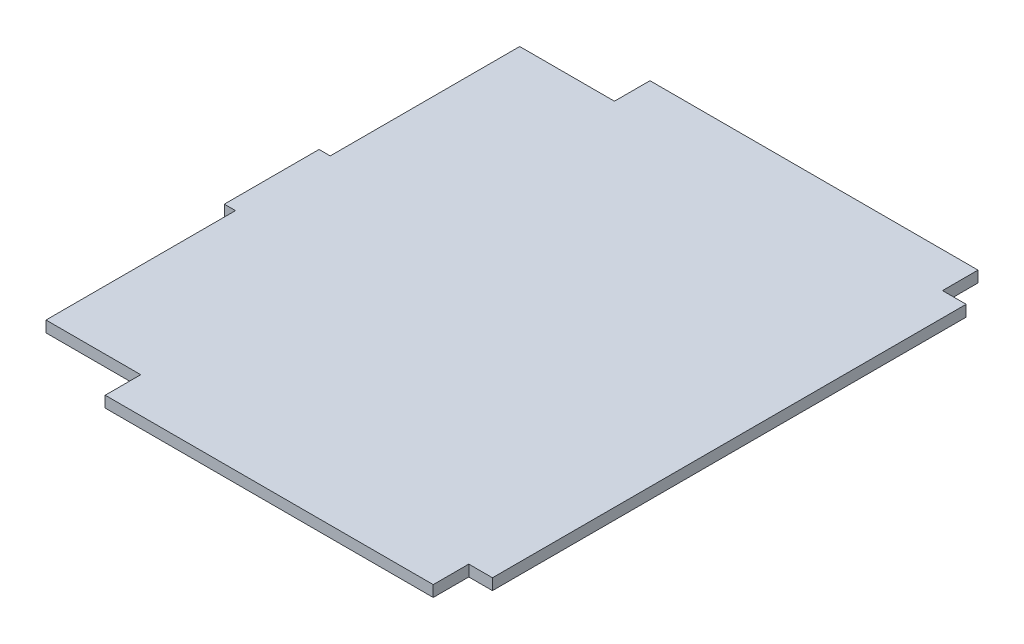
ISO-10303-21;
HEADER;
FILE_DESCRIPTION(('STEP AP214'),'2;1');
FILE_NAME('part.step','',(''),(''),'','','');
FILE_SCHEMA(('AUTOMOTIVE_DESIGN { 1 0 10303 214 1 1 1 1 }'));
ENDSEC;
DATA;
#1=APPLICATION_CONTEXT('core data for automotive mechanical design processes');
#2=APPLICATION_PROTOCOL_DEFINITION('international standard','automotive_design',2000,#1);
#3=PRODUCT_CONTEXT('',#1,'mechanical');
#4=PRODUCT('Part','Part','',(#3));
#5=PRODUCT_RELATED_PRODUCT_CATEGORY('part','',(#4));
#6=PRODUCT_DEFINITION_FORMATION('','',#4);
#7=PRODUCT_DEFINITION_CONTEXT('part definition',#1,'design');
#8=PRODUCT_DEFINITION('design','',#6,#7);
#9=PRODUCT_DEFINITION_SHAPE('','',#8);
#10=(LENGTH_UNIT() NAMED_UNIT(*) SI_UNIT(.MILLI.,.METRE.));
#11=(NAMED_UNIT(*) PLANE_ANGLE_UNIT() SI_UNIT($,.RADIAN.));
#12=(NAMED_UNIT(*) SI_UNIT($,.STERADIAN.) SOLID_ANGLE_UNIT());
#13=UNCERTAINTY_MEASURE_WITH_UNIT(LENGTH_MEASURE(1.E-05),#10,'distance_accuracy_value','');
#14=(GEOMETRIC_REPRESENTATION_CONTEXT(3) GLOBAL_UNCERTAINTY_ASSIGNED_CONTEXT((#13)) GLOBAL_UNIT_ASSIGNED_CONTEXT((#10,
#11,#12)) REPRESENTATION_CONTEXT('',''));
#15=CARTESIAN_POINT('',(0.,0.,0.));
#16=DIRECTION('',(0.,0.,1.));
#17=DIRECTION('',(1.,0.,0.));
#18=AXIS2_PLACEMENT_3D('',#15,#16,#17);
#19=CARTESIAN_POINT('',(0.,2.9972,73.025));
#20=DIRECTION('',(0.,0.,1.));
#21=DIRECTION('',(1.,0.,0.));
#22=AXIS2_PLACEMENT_3D('',#19,#20,#21);
#23=PLANE('',#22);
#24=DIRECTION('',(-1.,0.,0.));
#25=VECTOR('',#24,1.);
#26=CARTESIAN_POINT('',(0.,0.,73.025));
#27=LINE('',#26,#25);
#28=CARTESIAN_POINT('',(53.497343983,0.,73.025));
#29=VERTEX_POINT('',#28);
#30=CARTESIAN_POINT('',(-34.447343983,0.,73.025));
#31=VERTEX_POINT('',#30);
#32=EDGE_CURVE('E288',#29,#31,#27,.T.);
#33=ORIENTED_EDGE('',*,*,#32,.F.);
#34=DIRECTION('',(0.,-1.,0.));
#35=VECTOR('',#34,1.);
#36=CARTESIAN_POINT('',(53.497343983,2.9972,73.025));
#37=LINE('',#36,#35);
#38=CARTESIAN_POINT('',(53.497343983,2.9972,73.025));
#39=VERTEX_POINT('',#38);
#40=EDGE_CURVE('E11',#39,#29,#37,.T.);
#41=ORIENTED_EDGE('',*,*,#40,.F.);
#42=DIRECTION('',(-1.,0.,0.));
#43=VECTOR('',#42,1.);
#44=CARTESIAN_POINT('',(0.,2.9972,73.025));
#45=LINE('',#44,#43);
#46=CARTESIAN_POINT('',(-34.447343983,2.9972,73.025));
#47=VERTEX_POINT('',#46);
#48=EDGE_CURVE('E225',#39,#47,#45,.T.);
#49=ORIENTED_EDGE('',*,*,#48,.T.);
#50=DIRECTION('',(0.,-1.,0.));
#51=VECTOR('',#50,1.);
#52=CARTESIAN_POINT('',(-34.447343983,2.9972,73.025));
#53=LINE('',#52,#51);
#54=EDGE_CURVE('E58',#47,#31,#53,.T.);
#55=ORIENTED_EDGE('',*,*,#54,.T.);
#56=EDGE_LOOP('',(#33,#41,#49,#55));
#57=FACE_BOUND('',#56,.T.);
#58=ADVANCED_FACE('F41',(#57),#23,.T.);
#59=CARTESIAN_POINT('',(53.497343983,2.9972,0.));
#60=DIRECTION('',(-1.,0.,0.));
#61=DIRECTION('',(0.,0.,1.));
#62=AXIS2_PLACEMENT_3D('',#59,#60,#61);
#63=PLANE('',#62);
#64=DIRECTION('',(0.,0.,-1.));
#65=VECTOR('',#64,1.);
#66=CARTESIAN_POINT('',(53.497343983,0.,0.));
#67=LINE('',#66,#65);
#68=CARTESIAN_POINT('',(53.497343983,0.,63.5));
#69=VERTEX_POINT('',#68);
#70=EDGE_CURVE('E285',#29,#69,#67,.T.);
#71=ORIENTED_EDGE('',*,*,#70,.T.);
#72=DIRECTION('',(0.,-1.,0.));
#73=VECTOR('',#72,1.);
#74=CARTESIAN_POINT('',(53.497343983,2.9972,63.5));
#75=LINE('',#74,#73);
#76=CARTESIAN_POINT('',(53.497343983,2.9972,63.5));
#77=VERTEX_POINT('',#76);
#78=EDGE_CURVE('E50',#77,#69,#75,.T.);
#79=ORIENTED_EDGE('',*,*,#78,.F.);
#80=DIRECTION('',(0.,0.,-1.));
#81=VECTOR('',#80,1.);
#82=CARTESIAN_POINT('',(53.497343983,2.9972,0.));
#83=LINE('',#82,#81);
#84=EDGE_CURVE('E222',#39,#77,#83,.T.);
#85=ORIENTED_EDGE('',*,*,#84,.F.);
#86=ORIENTED_EDGE('',*,*,#40,.T.);
#87=EDGE_LOOP('',(#71,#79,#85,#86));
#88=FACE_BOUND('',#87,.T.);
#89=ADVANCED_FACE('F286',(#88),#63,.F.);
#90=CARTESIAN_POINT('',(0.,2.9972,63.5));
#91=DIRECTION('',(0.,0.,1.));
#92=DIRECTION('',(1.,0.,0.));
#93=AXIS2_PLACEMENT_3D('',#90,#91,#92);
#94=PLANE('',#93);
#95=DIRECTION('',(-1.,0.,0.));
#96=VECTOR('',#95,1.);
#97=CARTESIAN_POINT('',(0.,0.,63.5));
#98=LINE('',#97,#96);
#99=CARTESIAN_POINT('',(59.847343983,0.,63.5));
#100=VERTEX_POINT('',#99);
#101=EDGE_CURVE('E281',#100,#69,#98,.T.);
#102=ORIENTED_EDGE('',*,*,#101,.F.);
#103=DIRECTION('',(0.,-1.,0.));
#104=VECTOR('',#103,1.);
#105=CARTESIAN_POINT('',(59.847343983,2.9972,63.5));
#106=LINE('',#105,#104);
#107=CARTESIAN_POINT('',(59.847343983,2.9972,63.5));
#108=VERTEX_POINT('',#107);
#109=EDGE_CURVE('E272',#108,#100,#106,.T.);
#110=ORIENTED_EDGE('',*,*,#109,.F.);
#111=DIRECTION('',(-1.,0.,0.));
#112=VECTOR('',#111,1.);
#113=CARTESIAN_POINT('',(0.,2.9972,63.5));
#114=LINE('',#113,#112);
#115=EDGE_CURVE('E218',#108,#77,#114,.T.);
#116=ORIENTED_EDGE('',*,*,#115,.T.);
#117=ORIENTED_EDGE('',*,*,#78,.T.);
#118=EDGE_LOOP('',(#102,#110,#116,#117));
#119=FACE_BOUND('',#118,.T.);
#120=ADVANCED_FACE('F279',(#119),#94,.T.);
#121=CARTESIAN_POINT('',(59.847343983,2.9972,0.));
#122=DIRECTION('',(-1.,0.,0.));
#123=DIRECTION('',(0.,0.,1.));
#124=AXIS2_PLACEMENT_3D('',#121,#122,#123);
#125=PLANE('',#124);
#126=DIRECTION('',(0.,0.,-1.));
#127=VECTOR('',#126,1.);
#128=CARTESIAN_POINT('',(59.847343983,0.,0.));
#129=LINE('',#128,#127);
#130=CARTESIAN_POINT('',(59.847343983,0.,-63.5));
#131=VERTEX_POINT('',#130);
#132=EDGE_CURVE('E293',#100,#131,#129,.T.);
#133=ORIENTED_EDGE('',*,*,#132,.T.);
#134=DIRECTION('',(0.,-1.,0.));
#135=VECTOR('',#134,1.);
#136=CARTESIAN_POINT('',(59.847343983,2.9972,-63.5));
#137=LINE('',#136,#135);
#138=CARTESIAN_POINT('',(59.847343983,2.9972,-63.5));
#139=VERTEX_POINT('',#138);
#140=EDGE_CURVE('E268',#139,#131,#137,.T.);
#141=ORIENTED_EDGE('',*,*,#140,.F.);
#142=DIRECTION('',(0.,0.,-1.));
#143=VECTOR('',#142,1.);
#144=CARTESIAN_POINT('',(59.847343983,2.9972,0.));
#145=LINE('',#144,#143);
#146=EDGE_CURVE('E215',#108,#139,#145,.T.);
#147=ORIENTED_EDGE('',*,*,#146,.F.);
#148=ORIENTED_EDGE('',*,*,#109,.T.);
#149=EDGE_LOOP('',(#133,#141,#147,#148));
#150=FACE_BOUND('',#149,.T.);
#151=ADVANCED_FACE('F371',(#150),#125,.F.);
#152=CARTESIAN_POINT('',(0.,2.9972,-63.5));
#153=DIRECTION('',(0.,0.,1.));
#154=DIRECTION('',(1.,0.,0.));
#155=AXIS2_PLACEMENT_3D('',#152,#153,#154);
#156=PLANE('',#155);
#157=DIRECTION('',(-1.,0.,0.));
#158=VECTOR('',#157,1.);
#159=CARTESIAN_POINT('',(0.,0.,-63.5));
#160=LINE('',#159,#158);
#161=CARTESIAN_POINT('',(53.497343983,0.,-63.5));
#162=VERTEX_POINT('',#161);
#163=EDGE_CURVE('E297',#131,#162,#160,.T.);
#164=ORIENTED_EDGE('',*,*,#163,.T.);
#165=DIRECTION('',(0.,-1.,0.));
#166=VECTOR('',#165,1.);
#167=CARTESIAN_POINT('',(53.497343983,2.9972,-63.5));
#168=LINE('',#167,#166);
#169=CARTESIAN_POINT('',(53.497343983,2.9972,-63.5));
#170=VERTEX_POINT('',#169);
#171=EDGE_CURVE('E265',#170,#162,#168,.T.);
#172=ORIENTED_EDGE('',*,*,#171,.F.);
#173=DIRECTION('',(-1.,0.,0.));
#174=VECTOR('',#173,1.);
#175=CARTESIAN_POINT('',(0.,2.9972,-63.5));
#176=LINE('',#175,#174);
#177=EDGE_CURVE('E212',#139,#170,#176,.T.);
#178=ORIENTED_EDGE('',*,*,#177,.F.);
#179=ORIENTED_EDGE('',*,*,#140,.T.);
#180=EDGE_LOOP('',(#164,#172,#178,#179));
#181=FACE_BOUND('',#180,.T.);
#182=ADVANCED_FACE('F366',(#181),#156,.F.);
#183=CARTESIAN_POINT('',(53.497343983,2.9972,0.));
#184=DIRECTION('',(1.,0.,0.));
#185=DIRECTION('',(0.,0.,-1.));
#186=AXIS2_PLACEMENT_3D('',#183,#184,#185);
#187=PLANE('',#186);
#188=DIRECTION('',(0.,0.,1.));
#189=VECTOR('',#188,1.);
#190=CARTESIAN_POINT('',(53.497343983,0.,0.));
#191=LINE('',#190,#189);
#192=CARTESIAN_POINT('',(53.497343983,0.,-73.025));
#193=VERTEX_POINT('',#192);
#194=EDGE_CURVE('E304',#193,#162,#191,.T.);
#195=ORIENTED_EDGE('',*,*,#194,.F.);
#196=DIRECTION('',(0.,-1.,0.));
#197=VECTOR('',#196,1.);
#198=CARTESIAN_POINT('',(53.497343983,2.9972,-73.025));
#199=LINE('',#198,#197);
#200=CARTESIAN_POINT('',(53.497343983,2.9972,-73.025));
#201=VERTEX_POINT('',#200);
#202=EDGE_CURVE('E262',#201,#193,#199,.T.);
#203=ORIENTED_EDGE('',*,*,#202,.F.);
#204=DIRECTION('',(0.,0.,1.));
#205=VECTOR('',#204,1.);
#206=CARTESIAN_POINT('',(53.497343983,2.9972,0.));
#207=LINE('',#206,#205);
#208=EDGE_CURVE('E208',#201,#170,#207,.T.);
#209=ORIENTED_EDGE('',*,*,#208,.T.);
#210=ORIENTED_EDGE('',*,*,#171,.T.);
#211=EDGE_LOOP('',(#195,#203,#209,#210));
#212=FACE_BOUND('',#211,.T.);
#213=ADVANCED_FACE('F363',(#212),#187,.T.);
#214=CARTESIAN_POINT('',(0.,2.9972,-73.025));
#215=DIRECTION('',(0.,0.,1.));
#216=DIRECTION('',(1.,0.,0.));
#217=AXIS2_PLACEMENT_3D('',#214,#215,#216);
#218=PLANE('',#217);
#219=DIRECTION('',(-1.,0.,0.));
#220=VECTOR('',#219,1.);
#221=CARTESIAN_POINT('',(0.,0.,-73.025));
#222=LINE('',#221,#220);
#223=CARTESIAN_POINT('',(-34.447343983,0.,-73.025));
#224=VERTEX_POINT('',#223);
#225=EDGE_CURVE('E308',#193,#224,#222,.T.);
#226=ORIENTED_EDGE('',*,*,#225,.T.);
#227=DIRECTION('',(0.,-1.,0.));
#228=VECTOR('',#227,1.);
#229=CARTESIAN_POINT('',(-34.447343983,2.9972,-73.025));
#230=LINE('',#229,#228);
#231=CARTESIAN_POINT('',(-34.447343983,2.9972,-73.025));
#232=VERTEX_POINT('',#231);
#233=EDGE_CURVE('E258',#232,#224,#230,.T.);
#234=ORIENTED_EDGE('',*,*,#233,.F.);
#235=DIRECTION('',(-1.,0.,0.));
#236=VECTOR('',#235,1.);
#237=CARTESIAN_POINT('',(0.,2.9972,-73.025));
#238=LINE('',#237,#236);
#239=EDGE_CURVE('E203',#201,#232,#238,.T.);
#240=ORIENTED_EDGE('',*,*,#239,.F.);
#241=ORIENTED_EDGE('',*,*,#202,.T.);
#242=EDGE_LOOP('',(#226,#234,#240,#241));
#243=FACE_BOUND('',#242,.T.);
#244=ADVANCED_FACE('F360',(#243),#218,.F.);
#245=CARTESIAN_POINT('',(-34.447343983,2.9972,0.));
#246=DIRECTION('',(1.,0.,0.));
#247=DIRECTION('',(0.,0.,-1.));
#248=AXIS2_PLACEMENT_3D('',#245,#246,#247);
#249=PLANE('',#248);
#250=DIRECTION('',(0.,0.,1.));
#251=VECTOR('',#250,1.);
#252=CARTESIAN_POINT('',(-34.447343983,0.,0.));
#253=LINE('',#252,#251);
#254=CARTESIAN_POINT('',(-34.447343983,0.,-63.5));
#255=VERTEX_POINT('',#254);
#256=EDGE_CURVE('E311',#224,#255,#253,.T.);
#257=ORIENTED_EDGE('',*,*,#256,.T.);
#258=DIRECTION('',(0.,-1.,0.));
#259=VECTOR('',#258,1.);
#260=CARTESIAN_POINT('',(-34.447343983,2.9972,-63.5));
#261=LINE('',#260,#259);
#262=CARTESIAN_POINT('',(-34.447343983,2.9972,-63.5));
#263=VERTEX_POINT('',#262);
#264=EDGE_CURVE('E255',#263,#255,#261,.T.);
#265=ORIENTED_EDGE('',*,*,#264,.F.);
#266=DIRECTION('',(0.,0.,1.));
#267=VECTOR('',#266,1.);
#268=CARTESIAN_POINT('',(-34.447343983,2.9972,0.));
#269=LINE('',#268,#267);
#270=EDGE_CURVE('E199',#232,#263,#269,.T.);
#271=ORIENTED_EDGE('',*,*,#270,.F.);
#272=ORIENTED_EDGE('',*,*,#233,.T.);
#273=EDGE_LOOP('',(#257,#265,#271,#272));
#274=FACE_BOUND('',#273,.T.);
#275=ADVANCED_FACE('F355',(#274),#249,.F.);
#276=CARTESIAN_POINT('',(0.,2.9972,-63.5));
#277=DIRECTION('',(0.,0.,-1.));
#278=DIRECTION('',(-1.,0.,0.));
#279=AXIS2_PLACEMENT_3D('',#276,#277,#278);
#280=PLANE('',#279);
#281=DIRECTION('',(1.,0.,0.));
#282=VECTOR('',#281,1.);
#283=CARTESIAN_POINT('',(0.,0.,-63.5));
#284=LINE('',#283,#282);
#285=CARTESIAN_POINT('',(-59.847343983,0.,-63.5));
#286=VERTEX_POINT('',#285);
#287=EDGE_CURVE('E315',#286,#255,#284,.T.);
#288=ORIENTED_EDGE('',*,*,#287,.F.);
#289=DIRECTION('',(0.,-1.,0.));
#290=VECTOR('',#289,1.);
#291=CARTESIAN_POINT('',(-59.847343983,2.9972,-63.5));
#292=LINE('',#291,#290);
#293=CARTESIAN_POINT('',(-59.847343983,2.9972,-63.5));
#294=VERTEX_POINT('',#293);
#295=EDGE_CURVE('E252',#294,#286,#292,.T.);
#296=ORIENTED_EDGE('',*,*,#295,.F.);
#297=DIRECTION('',(1.,0.,0.));
#298=VECTOR('',#297,1.);
#299=CARTESIAN_POINT('',(0.,2.9972,-63.5));
#300=LINE('',#299,#298);
#301=EDGE_CURVE('E193',#294,#263,#300,.T.);
#302=ORIENTED_EDGE('',*,*,#301,.T.);
#303=ORIENTED_EDGE('',*,*,#264,.T.);
#304=EDGE_LOOP('',(#288,#296,#302,#303));
#305=FACE_BOUND('',#304,.T.);
#306=ADVANCED_FACE('F349',(#305),#280,.T.);
#307=CARTESIAN_POINT('',(-59.847343983,2.9972,0.));
#308=DIRECTION('',(-1.,0.,0.));
#309=DIRECTION('',(0.,0.,1.));
#310=AXIS2_PLACEMENT_3D('',#307,#308,#309);
#311=PLANE('',#310);
#312=DIRECTION('',(0.,0.,-1.));
#313=VECTOR('',#312,1.);
#314=CARTESIAN_POINT('',(-59.847343983,0.,0.));
#315=LINE('',#314,#313);
#316=CARTESIAN_POINT('',(-59.847343983,0.,-12.7));
#317=VERTEX_POINT('',#316);
#318=EDGE_CURVE('E319',#317,#286,#315,.T.);
#319=ORIENTED_EDGE('',*,*,#318,.F.);
#320=DIRECTION('',(0.,-1.,0.));
#321=VECTOR('',#320,1.);
#322=CARTESIAN_POINT('',(-59.847343983,2.9972,-12.7));
#323=LINE('',#322,#321);
#324=CARTESIAN_POINT('',(-59.847343983,2.9972,-12.7));
#325=VERTEX_POINT('',#324);
#326=EDGE_CURVE('E249',#325,#317,#323,.T.);
#327=ORIENTED_EDGE('',*,*,#326,.F.);
#328=DIRECTION('',(0.,0.,-1.));
#329=VECTOR('',#328,1.);
#330=CARTESIAN_POINT('',(-59.847343983,2.9972,0.));
#331=LINE('',#330,#329);
#332=EDGE_CURVE('E184',#325,#294,#331,.T.);
#333=ORIENTED_EDGE('',*,*,#332,.T.);
#334=ORIENTED_EDGE('',*,*,#295,.T.);
#335=EDGE_LOOP('',(#319,#327,#333,#334));
#336=FACE_BOUND('',#335,.T.);
#337=ADVANCED_FACE('F347',(#336),#311,.T.);
#338=CARTESIAN_POINT('',(0.,2.9972,-12.7));
#339=DIRECTION('',(0.,0.,1.));
#340=DIRECTION('',(1.,0.,0.));
#341=AXIS2_PLACEMENT_3D('',#338,#339,#340);
#342=PLANE('',#341);
#343=DIRECTION('',(-1.,0.,0.));
#344=VECTOR('',#343,1.);
#345=CARTESIAN_POINT('',(0.,0.,-12.7));
#346=LINE('',#345,#344);
#347=CARTESIAN_POINT('',(-62.844543983,0.,-12.7));
#348=VERTEX_POINT('',#347);
#349=EDGE_CURVE('E323',#317,#348,#346,.T.);
#350=ORIENTED_EDGE('',*,*,#349,.T.);
#351=DIRECTION('',(0.,-1.,0.));
#352=VECTOR('',#351,1.);
#353=CARTESIAN_POINT('',(-62.844543983,2.9972,-12.7));
#354=LINE('',#353,#352);
#355=CARTESIAN_POINT('',(-62.844543983,2.9972,-12.7));
#356=VERTEX_POINT('',#355);
#357=EDGE_CURVE('E246',#356,#348,#354,.T.);
#358=ORIENTED_EDGE('',*,*,#357,.F.);
#359=DIRECTION('',(-1.,0.,0.));
#360=VECTOR('',#359,1.);
#361=CARTESIAN_POINT('',(0.,2.9972,-12.7));
#362=LINE('',#361,#360);
#363=EDGE_CURVE('E192',#325,#356,#362,.T.);
#364=ORIENTED_EDGE('',*,*,#363,.F.);
#365=ORIENTED_EDGE('',*,*,#326,.T.);
#366=EDGE_LOOP('',(#350,#358,#364,#365));
#367=FACE_BOUND('',#366,.T.);
#368=ADVANCED_FACE('F345',(#367),#342,.F.);
#369=CARTESIAN_POINT('',(-62.844543983,2.9972,0.));
#370=DIRECTION('',(-1.,0.,0.));
#371=DIRECTION('',(0.,0.,1.));
#372=AXIS2_PLACEMENT_3D('',#369,#370,#371);
#373=PLANE('',#372);
#374=DIRECTION('',(0.,0.,-1.));
#375=VECTOR('',#374,1.);
#376=CARTESIAN_POINT('',(-62.844543983,0.,0.));
#377=LINE('',#376,#375);
#378=CARTESIAN_POINT('',(-62.844543983,0.,12.7));
#379=VERTEX_POINT('',#378);
#380=EDGE_CURVE('E327',#379,#348,#377,.T.);
#381=ORIENTED_EDGE('',*,*,#380,.F.);
#382=DIRECTION('',(0.,-1.,0.));
#383=VECTOR('',#382,1.);
#384=CARTESIAN_POINT('',(-62.844543983,2.9972,12.7));
#385=LINE('',#384,#383);
#386=CARTESIAN_POINT('',(-62.844543983,2.9972,12.7));
#387=VERTEX_POINT('',#386);
#388=EDGE_CURVE('E243',#387,#379,#385,.T.);
#389=ORIENTED_EDGE('',*,*,#388,.F.);
#390=DIRECTION('',(0.,0.,-1.));
#391=VECTOR('',#390,1.);
#392=CARTESIAN_POINT('',(-62.844543983,2.9972,0.));
#393=LINE('',#392,#391);
#394=EDGE_CURVE('E186',#387,#356,#393,.T.);
#395=ORIENTED_EDGE('',*,*,#394,.T.);
#396=ORIENTED_EDGE('',*,*,#357,.T.);
#397=EDGE_LOOP('',(#381,#389,#395,#396));
#398=FACE_BOUND('',#397,.T.);
#399=ADVANCED_FACE('F341',(#398),#373,.T.);
#400=CARTESIAN_POINT('',(0.,2.9972,12.7000000000001));
#401=DIRECTION('',(0.,0.,1.));
#402=DIRECTION('',(1.,0.,0.));
#403=AXIS2_PLACEMENT_3D('',#400,#401,#402);
#404=PLANE('',#403);
#405=DIRECTION('',(-1.,0.,0.));
#406=VECTOR('',#405,1.);
#407=CARTESIAN_POINT('',(0.,0.,12.7000000000001));
#408=LINE('',#407,#406);
#409=CARTESIAN_POINT('',(-59.847343983,0.,12.7));
#410=VERTEX_POINT('',#409);
#411=EDGE_CURVE('E330',#410,#379,#408,.T.);
#412=ORIENTED_EDGE('',*,*,#411,.F.);
#413=DIRECTION('',(0.,-1.,0.));
#414=VECTOR('',#413,1.);
#415=CARTESIAN_POINT('',(-59.847343983,2.9972,12.7));
#416=LINE('',#415,#414);
#417=CARTESIAN_POINT('',(-59.847343983,2.9972,12.7));
#418=VERTEX_POINT('',#417);
#419=EDGE_CURVE('E167',#418,#410,#416,.T.);
#420=ORIENTED_EDGE('',*,*,#419,.F.);
#421=DIRECTION('',(-1.,0.,0.));
#422=VECTOR('',#421,1.);
#423=CARTESIAN_POINT('',(0.,2.9972,12.7000000000001));
#424=LINE('',#423,#422);
#425=EDGE_CURVE('E181',#418,#387,#424,.T.);
#426=ORIENTED_EDGE('',*,*,#425,.T.);
#427=ORIENTED_EDGE('',*,*,#388,.T.);
#428=EDGE_LOOP('',(#412,#420,#426,#427));
#429=FACE_BOUND('',#428,.T.);
#430=ADVANCED_FACE('F338',(#429),#404,.T.);
#431=CARTESIAN_POINT('',(-59.847343983,0.,63.5));
#432=VERTEX_POINT('',#431);
#433=EDGE_CURVE('E163',#432,#410,#315,.T.);
#434=ORIENTED_EDGE('',*,*,#433,.F.);
#435=DIRECTION('',(0.,-1.,0.));
#436=VECTOR('',#435,1.);
#437=CARTESIAN_POINT('',(-59.847343983,2.9972,63.5));
#438=LINE('',#437,#436);
#439=CARTESIAN_POINT('',(-59.847343983,2.9972,63.5));
#440=VERTEX_POINT('',#439);
#441=EDGE_CURVE('E157',#440,#432,#438,.T.);
#442=ORIENTED_EDGE('',*,*,#441,.F.);
#443=EDGE_CURVE('E161',#440,#418,#331,.T.);
#444=ORIENTED_EDGE('',*,*,#443,.T.);
#445=ORIENTED_EDGE('',*,*,#419,.T.);
#446=EDGE_LOOP('',(#434,#442,#444,#445));
#447=FACE_BOUND('',#446,.T.);
#448=ADVANCED_FACE('F159',(#447),#311,.T.);
#449=CARTESIAN_POINT('',(0.,2.9972,63.5));
#450=DIRECTION('',(0.,0.,-1.));
#451=DIRECTION('',(-1.,0.,0.));
#452=AXIS2_PLACEMENT_3D('',#449,#450,#451);
#453=PLANE('',#452);
#454=DIRECTION('',(1.,0.,0.));
#455=VECTOR('',#454,1.);
#456=CARTESIAN_POINT('',(0.,0.,63.5));
#457=LINE('',#456,#455);
#458=CARTESIAN_POINT('',(-34.447343983,0.,63.5));
#459=VERTEX_POINT('',#458);
#460=EDGE_CURVE('E230',#432,#459,#457,.T.);
#461=ORIENTED_EDGE('',*,*,#460,.T.);
#462=DIRECTION('',(0.,-1.,0.));
#463=VECTOR('',#462,1.);
#464=CARTESIAN_POINT('',(-34.447343983,2.9972,63.5));
#465=LINE('',#464,#463);
#466=CARTESIAN_POINT('',(-34.447343983,2.9972,63.5));
#467=VERTEX_POINT('',#466);
#468=EDGE_CURVE('E108',#467,#459,#465,.T.);
#469=ORIENTED_EDGE('',*,*,#468,.F.);
#470=DIRECTION('',(1.,0.,0.));
#471=VECTOR('',#470,1.);
#472=CARTESIAN_POINT('',(0.,2.9972,63.5));
#473=LINE('',#472,#471);
#474=EDGE_CURVE('E169',#440,#467,#473,.T.);
#475=ORIENTED_EDGE('',*,*,#474,.F.);
#476=ORIENTED_EDGE('',*,*,#441,.T.);
#477=EDGE_LOOP('',(#461,#469,#475,#476));
#478=FACE_BOUND('',#477,.T.);
#479=ADVANCED_FACE('F170',(#478),#453,.F.);
#480=CARTESIAN_POINT('',(-34.447343983,2.9972,0.));
#481=DIRECTION('',(-1.,0.,0.));
#482=DIRECTION('',(0.,0.,1.));
#483=AXIS2_PLACEMENT_3D('',#480,#481,#482);
#484=PLANE('',#483);
#485=DIRECTION('',(0.,0.,-1.));
#486=VECTOR('',#485,1.);
#487=CARTESIAN_POINT('',(-34.447343983,0.,0.));
#488=LINE('',#487,#486);
#489=EDGE_CURVE('E227',#31,#459,#488,.T.);
#490=ORIENTED_EDGE('',*,*,#489,.F.);
#491=ORIENTED_EDGE('',*,*,#54,.F.);
#492=DIRECTION('',(0.,0.,-1.));
#493=VECTOR('',#492,1.);
#494=CARTESIAN_POINT('',(-34.447343983,2.9972,0.));
#495=LINE('',#494,#493);
#496=EDGE_CURVE('E174',#47,#467,#495,.T.);
#497=ORIENTED_EDGE('',*,*,#496,.T.);
#498=ORIENTED_EDGE('',*,*,#468,.T.);
#499=EDGE_LOOP('',(#490,#491,#497,#498));
#500=FACE_BOUND('',#499,.T.);
#501=ADVANCED_FACE('F375',(#500),#484,.T.);
#502=CARTESIAN_POINT('',(0.,2.9972,0.));
#503=DIRECTION('',(0.,1.,0.));
#504=DIRECTION('',(0.,0.,1.));
#505=AXIS2_PLACEMENT_3D('',#502,#503,#504);
#506=PLANE('',#505);
#507=ORIENTED_EDGE('',*,*,#48,.F.);
#508=ORIENTED_EDGE('',*,*,#84,.T.);
#509=ORIENTED_EDGE('',*,*,#115,.F.);
#510=ORIENTED_EDGE('',*,*,#146,.T.);
#511=ORIENTED_EDGE('',*,*,#177,.T.);
#512=ORIENTED_EDGE('',*,*,#208,.F.);
#513=ORIENTED_EDGE('',*,*,#239,.T.);
#514=ORIENTED_EDGE('',*,*,#270,.T.);
#515=ORIENTED_EDGE('',*,*,#301,.F.);
#516=ORIENTED_EDGE('',*,*,#332,.F.);
#517=ORIENTED_EDGE('',*,*,#363,.T.);
#518=ORIENTED_EDGE('',*,*,#394,.F.);
#519=ORIENTED_EDGE('',*,*,#425,.F.);
#520=ORIENTED_EDGE('',*,*,#443,.F.);
#521=ORIENTED_EDGE('',*,*,#474,.T.);
#522=ORIENTED_EDGE('',*,*,#496,.F.);
#523=EDGE_LOOP('',(#507,#508,#509,#510,#511,#512,#513,#514,#515,#516,#517,#518,#519,#520,#521,#522));
#524=FACE_BOUND('',#523,.T.);
#525=ADVANCED_FACE('F178',(#524),#506,.T.);
#526=CARTESIAN_POINT('',(0.,0.,0.));
#527=DIRECTION('',(0.,1.,0.));
#528=DIRECTION('',(0.,0.,1.));
#529=AXIS2_PLACEMENT_3D('',#526,#527,#528);
#530=PLANE('',#529);
#531=ORIENTED_EDGE('',*,*,#32,.T.);
#532=ORIENTED_EDGE('',*,*,#489,.T.);
#533=ORIENTED_EDGE('',*,*,#460,.F.);
#534=ORIENTED_EDGE('',*,*,#433,.T.);
#535=ORIENTED_EDGE('',*,*,#411,.T.);
#536=ORIENTED_EDGE('',*,*,#380,.T.);
#537=ORIENTED_EDGE('',*,*,#349,.F.);
#538=ORIENTED_EDGE('',*,*,#318,.T.);
#539=ORIENTED_EDGE('',*,*,#287,.T.);
#540=ORIENTED_EDGE('',*,*,#256,.F.);
#541=ORIENTED_EDGE('',*,*,#225,.F.);
#542=ORIENTED_EDGE('',*,*,#194,.T.);
#543=ORIENTED_EDGE('',*,*,#163,.F.);
#544=ORIENTED_EDGE('',*,*,#132,.F.);
#545=ORIENTED_EDGE('',*,*,#101,.T.);
#546=ORIENTED_EDGE('',*,*,#70,.F.);
#547=EDGE_LOOP('',(#531,#532,#533,#534,#535,#536,#537,#538,#539,#540,#541,#542,#543,#544,#545,#546));
#548=FACE_BOUND('',#547,.T.);
#549=ADVANCED_FACE('F291',(#548),#530,.F.);
#550=CLOSED_SHELL('',(#58,#89,#120,#151,#182,#213,#244,#275,#306,#337,#368,#399,#430,#448,#479,
#501,#525,#549));
#551=MANIFOLD_SOLID_BREP('B2',#550);
#552=ADVANCED_BREP_SHAPE_REPRESENTATION('',(#18,#551),#14);
#553=SHAPE_DEFINITION_REPRESENTATION(#9,#552);
ENDSEC;
END-ISO-10303-21;
